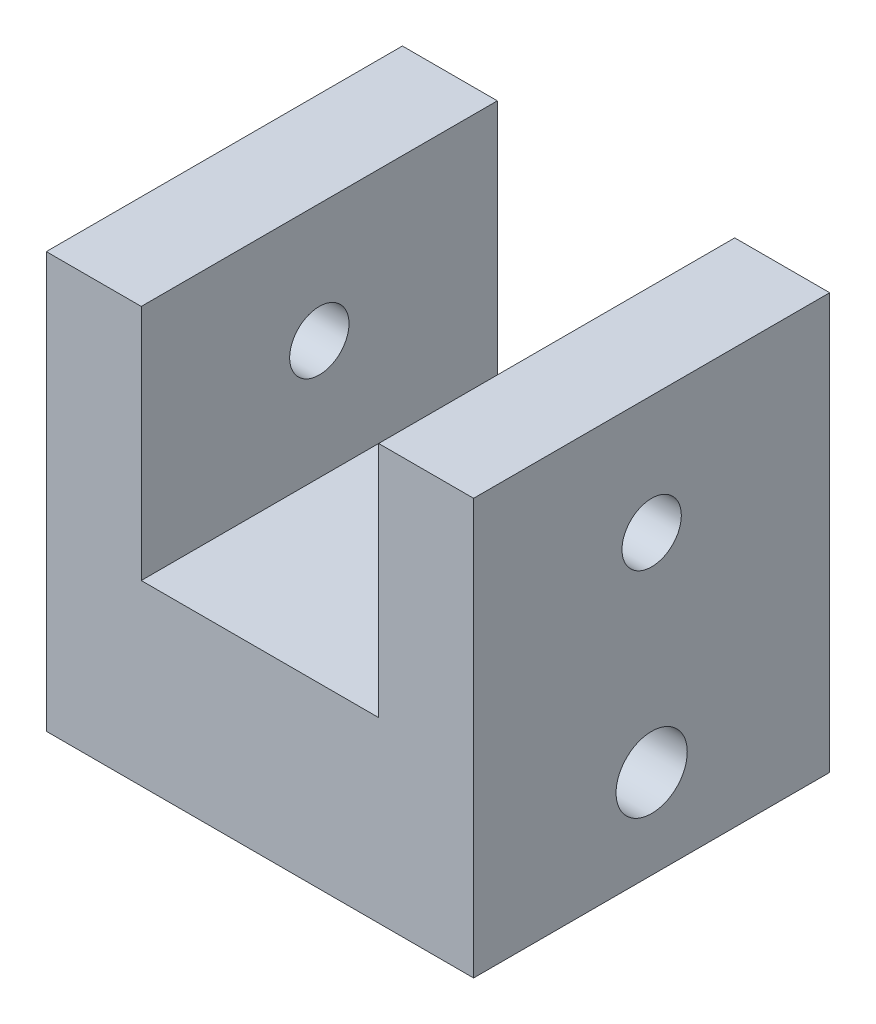
ISO-10303-21;
HEADER;
FILE_DESCRIPTION(('STEP AP214'),'2;1');
FILE_NAME('part.step','',(''),(''),'','','');
FILE_SCHEMA(('AUTOMOTIVE_DESIGN { 1 0 10303 214 1 1 1 1 }'));
ENDSEC;
DATA;
#1=APPLICATION_CONTEXT('core data for automotive mechanical design processes');
#2=APPLICATION_PROTOCOL_DEFINITION('international standard','automotive_design',2000,#1);
#3=PRODUCT_CONTEXT('',#1,'mechanical');
#4=PRODUCT('Part','Part','',(#3));
#5=PRODUCT_RELATED_PRODUCT_CATEGORY('part','',(#4));
#6=PRODUCT_DEFINITION_FORMATION('','',#4);
#7=PRODUCT_DEFINITION_CONTEXT('part definition',#1,'design');
#8=PRODUCT_DEFINITION('design','',#6,#7);
#9=PRODUCT_DEFINITION_SHAPE('','',#8);
#10=(LENGTH_UNIT() NAMED_UNIT(*) SI_UNIT(.MILLI.,.METRE.));
#11=(NAMED_UNIT(*) PLANE_ANGLE_UNIT() SI_UNIT($,.RADIAN.));
#12=(NAMED_UNIT(*) SI_UNIT($,.STERADIAN.) SOLID_ANGLE_UNIT());
#13=UNCERTAINTY_MEASURE_WITH_UNIT(LENGTH_MEASURE(1.E-05),#10,'distance_accuracy_value','');
#14=(GEOMETRIC_REPRESENTATION_CONTEXT(3) GLOBAL_UNCERTAINTY_ASSIGNED_CONTEXT((#13)) GLOBAL_UNIT_ASSIGNED_CONTEXT((#10,
#11,#12)) REPRESENTATION_CONTEXT('',''));
#15=CARTESIAN_POINT('',(0.,0.,0.));
#16=DIRECTION('',(0.,0.,1.));
#17=DIRECTION('',(1.,0.,0.));
#18=AXIS2_PLACEMENT_3D('',#15,#16,#17);
#19=CARTESIAN_POINT('',(0.,0.,30.));
#20=DIRECTION('',(-1.,0.,0.));
#21=DIRECTION('',(0.,0.,1.));
#22=AXIS2_PLACEMENT_3D('',#19,#20,#21);
#23=PLANE('',#22);
#24=CARTESIAN_POINT('',(0.,10.,15.));
#25=DIRECTION('',(-1.,0.,0.));
#26=DIRECTION('',(0.,0.,1.));
#27=AXIS2_PLACEMENT_3D('',#24,#25,#26);
#28=CIRCLE('',#27,2.5);
#29=CARTESIAN_POINT('',(0.,10.,17.5));
#30=VERTEX_POINT('',#29);
#31=EDGE_CURVE('E152',#30,#30,#28,.T.);
#32=ORIENTED_EDGE('',*,*,#31,.T.);
#33=EDGE_LOOP('',(#32));
#34=FACE_BOUND('',#33,.T.);
#35=DIRECTION('',(0.,1.,0.));
#36=VECTOR('',#35,1.);
#37=CARTESIAN_POINT('',(0.,0.,0.));
#38=LINE('',#37,#36);
#39=CARTESIAN_POINT('',(0.,0.,0.));
#40=VERTEX_POINT('',#39);
#41=CARTESIAN_POINT('',(0.,20.,0.));
#42=VERTEX_POINT('',#41);
#43=EDGE_CURVE('E147',#40,#42,#38,.T.);
#44=ORIENTED_EDGE('',*,*,#43,.T.);
#45=DIRECTION('',(0.,0.,-1.));
#46=VECTOR('',#45,1.);
#47=CARTESIAN_POINT('',(0.,20.,30.));
#48=LINE('',#47,#46);
#49=CARTESIAN_POINT('',(0.,20.,30.));
#50=VERTEX_POINT('',#49);
#51=EDGE_CURVE('E11',#50,#42,#48,.T.);
#52=ORIENTED_EDGE('',*,*,#51,.F.);
#53=DIRECTION('',(0.,1.,0.));
#54=VECTOR('',#53,1.);
#55=CARTESIAN_POINT('',(0.,0.,30.));
#56=LINE('',#55,#54);
#57=CARTESIAN_POINT('',(0.,0.,30.));
#58=VERTEX_POINT('',#57);
#59=EDGE_CURVE('E170',#58,#50,#56,.T.);
#60=ORIENTED_EDGE('',*,*,#59,.F.);
#61=DIRECTION('',(0.,0.,-1.));
#62=VECTOR('',#61,1.);
#63=CARTESIAN_POINT('',(0.,0.,30.));
#64=LINE('',#63,#62);
#65=EDGE_CURVE('E143',#58,#40,#64,.T.);
#66=ORIENTED_EDGE('',*,*,#65,.T.);
#67=EDGE_LOOP('',(#44,#52,#60,#66));
#68=FACE_BOUND('',#67,.T.);
#69=ADVANCED_FACE('F45',(#34,#68),#23,.F.);
#70=CARTESIAN_POINT('',(-8.,20.,30.));
#71=DIRECTION('',(0.,-1.,0.));
#72=DIRECTION('',(0.,0.,-1.));
#73=AXIS2_PLACEMENT_3D('',#70,#71,#72);
#74=PLANE('',#73);
#75=DIRECTION('',(-1.,0.,0.));
#76=VECTOR('',#75,1.);
#77=CARTESIAN_POINT('',(-8.,20.,0.));
#78=LINE('',#77,#76);
#79=CARTESIAN_POINT('',(-8.,20.,0.));
#80=VERTEX_POINT('',#79);
#81=EDGE_CURVE('E151',#42,#80,#78,.T.);
#82=ORIENTED_EDGE('',*,*,#81,.T.);
#83=DIRECTION('',(0.,0.,-1.));
#84=VECTOR('',#83,1.);
#85=CARTESIAN_POINT('',(-8.,20.,30.));
#86=LINE('',#85,#84);
#87=CARTESIAN_POINT('',(-8.,20.,30.));
#88=VERTEX_POINT('',#87);
#89=EDGE_CURVE('E55',#88,#80,#86,.T.);
#90=ORIENTED_EDGE('',*,*,#89,.F.);
#91=DIRECTION('',(-1.,0.,0.));
#92=VECTOR('',#91,1.);
#93=CARTESIAN_POINT('',(-8.,20.,30.));
#94=LINE('',#93,#92);
#95=EDGE_CURVE('E106',#50,#88,#94,.T.);
#96=ORIENTED_EDGE('',*,*,#95,.F.);
#97=ORIENTED_EDGE('',*,*,#51,.T.);
#98=EDGE_LOOP('',(#82,#90,#96,#97));
#99=FACE_BOUND('',#98,.T.);
#100=ADVANCED_FACE('F258',(#99),#74,.F.);
#101=CARTESIAN_POINT('',(-8.,20.,30.));
#102=DIRECTION('',(1.,0.,0.));
#103=DIRECTION('',(0.,1.,0.));
#104=AXIS2_PLACEMENT_3D('',#101,#102,#103);
#105=PLANE('',#104);
#106=CARTESIAN_POINT('',(-8.,-7.5,15.));
#107=DIRECTION('',(1.,0.,0.));
#108=DIRECTION('',(0.,0.,-1.));
#109=AXIS2_PLACEMENT_3D('',#106,#107,#108);
#110=CIRCLE('',#109,3.);
#111=CARTESIAN_POINT('',(-8.,-7.5,12.));
#112=VERTEX_POINT('',#111);
#113=EDGE_CURVE('E230',#112,#112,#110,.T.);
#114=ORIENTED_EDGE('',*,*,#113,.T.);
#115=EDGE_LOOP('',(#114));
#116=FACE_BOUND('',#115,.T.);
#117=CARTESIAN_POINT('',(-8.,10.,15.));
#118=DIRECTION('',(1.,0.,0.));
#119=DIRECTION('',(0.,0.,-1.));
#120=AXIS2_PLACEMENT_3D('',#117,#118,#119);
#121=CIRCLE('',#120,2.5);
#122=CARTESIAN_POINT('',(-8.,10.,12.5));
#123=VERTEX_POINT('',#122);
#124=EDGE_CURVE('E218',#123,#123,#121,.T.);
#125=ORIENTED_EDGE('',*,*,#124,.T.);
#126=EDGE_LOOP('',(#125));
#127=FACE_BOUND('',#126,.T.);
#128=DIRECTION('',(0.,-1.,0.));
#129=VECTOR('',#128,1.);
#130=CARTESIAN_POINT('',(-8.,20.,0.));
#131=LINE('',#130,#129);
#132=CARTESIAN_POINT('',(-7.99999999999999,-15.,0.));
#133=VERTEX_POINT('',#132);
#134=EDGE_CURVE('E155',#80,#133,#131,.T.);
#135=ORIENTED_EDGE('',*,*,#134,.T.);
#136=DIRECTION('',(0.,0.,-1.));
#137=VECTOR('',#136,1.);
#138=CARTESIAN_POINT('',(-7.99999999999999,-15.,30.));
#139=LINE('',#138,#137);
#140=CARTESIAN_POINT('',(-7.99999999999999,-15.,30.));
#141=VERTEX_POINT('',#140);
#142=EDGE_CURVE('E181',#141,#133,#139,.T.);
#143=ORIENTED_EDGE('',*,*,#142,.F.);
#144=DIRECTION('',(0.,-1.,0.));
#145=VECTOR('',#144,1.);
#146=CARTESIAN_POINT('',(-8.,20.,30.));
#147=LINE('',#146,#145);
#148=EDGE_CURVE('E192',#88,#141,#147,.T.);
#149=ORIENTED_EDGE('',*,*,#148,.F.);
#150=ORIENTED_EDGE('',*,*,#89,.T.);
#151=EDGE_LOOP('',(#135,#143,#149,#150));
#152=FACE_BOUND('',#151,.T.);
#153=ADVANCED_FACE('F190',(#116,#127,#152),#105,.F.);
#154=CARTESIAN_POINT('',(-7.99999999999999,-15.,30.));
#155=DIRECTION('',(0.,1.,0.));
#156=DIRECTION('',(0.,0.,1.));
#157=AXIS2_PLACEMENT_3D('',#154,#155,#156);
#158=PLANE('',#157);
#159=DIRECTION('',(1.,0.,0.));
#160=VECTOR('',#159,1.);
#161=CARTESIAN_POINT('',(-7.99999999999999,-15.,0.));
#162=LINE('',#161,#160);
#163=CARTESIAN_POINT('',(28.,-15.,0.));
#164=VERTEX_POINT('',#163);
#165=EDGE_CURVE('E158',#133,#164,#162,.T.);
#166=ORIENTED_EDGE('',*,*,#165,.T.);
#167=DIRECTION('',(0.,0.,-1.));
#168=VECTOR('',#167,1.);
#169=CARTESIAN_POINT('',(28.,-15.,30.));
#170=LINE('',#169,#168);
#171=CARTESIAN_POINT('',(28.,-15.,30.));
#172=VERTEX_POINT('',#171);
#173=EDGE_CURVE('E177',#172,#164,#170,.T.);
#174=ORIENTED_EDGE('',*,*,#173,.F.);
#175=DIRECTION('',(1.,0.,0.));
#176=VECTOR('',#175,1.);
#177=CARTESIAN_POINT('',(-7.99999999999999,-15.,30.));
#178=LINE('',#177,#176);
#179=EDGE_CURVE('E205',#141,#172,#178,.T.);
#180=ORIENTED_EDGE('',*,*,#179,.F.);
#181=ORIENTED_EDGE('',*,*,#142,.T.);
#182=EDGE_LOOP('',(#166,#174,#180,#181));
#183=FACE_BOUND('',#182,.T.);
#184=ADVANCED_FACE('F200',(#183),#158,.F.);
#185=CARTESIAN_POINT('',(28.,20.,30.));
#186=DIRECTION('',(-1.,0.,0.));
#187=DIRECTION('',(0.,0.,1.));
#188=AXIS2_PLACEMENT_3D('',#185,#186,#187);
#189=PLANE('',#188);
#190=CARTESIAN_POINT('',(28.,-7.5,15.));
#191=DIRECTION('',(1.,0.,0.));
#192=DIRECTION('',(0.,0.,-1.));
#193=AXIS2_PLACEMENT_3D('',#190,#191,#192);
#194=CIRCLE('',#193,3.);
#195=CARTESIAN_POINT('',(28.,-7.5,12.));
#196=VERTEX_POINT('',#195);
#197=EDGE_CURVE('E226',#196,#196,#194,.T.);
#198=ORIENTED_EDGE('',*,*,#197,.F.);
#199=EDGE_LOOP('',(#198));
#200=FACE_BOUND('',#199,.T.);
#201=CARTESIAN_POINT('',(28.,10.,15.));
#202=DIRECTION('',(1.,0.,0.));
#203=DIRECTION('',(0.,0.,-1.));
#204=AXIS2_PLACEMENT_3D('',#201,#202,#203);
#205=CIRCLE('',#204,2.5);
#206=CARTESIAN_POINT('',(28.,10.,12.5));
#207=VERTEX_POINT('',#206);
#208=EDGE_CURVE('E222',#207,#207,#205,.T.);
#209=ORIENTED_EDGE('',*,*,#208,.F.);
#210=EDGE_LOOP('',(#209));
#211=FACE_BOUND('',#210,.T.);
#212=DIRECTION('',(0.,1.,0.));
#213=VECTOR('',#212,1.);
#214=CARTESIAN_POINT('',(28.,20.,0.));
#215=LINE('',#214,#213);
#216=CARTESIAN_POINT('',(28.,20.,0.));
#217=VERTEX_POINT('',#216);
#218=EDGE_CURVE('E161',#164,#217,#215,.T.);
#219=ORIENTED_EDGE('',*,*,#218,.T.);
#220=DIRECTION('',(0.,0.,-1.));
#221=VECTOR('',#220,1.);
#222=CARTESIAN_POINT('',(28.,20.,30.));
#223=LINE('',#222,#221);
#224=CARTESIAN_POINT('',(28.,20.,30.));
#225=VERTEX_POINT('',#224);
#226=EDGE_CURVE('E136',#225,#217,#223,.T.);
#227=ORIENTED_EDGE('',*,*,#226,.F.);
#228=DIRECTION('',(0.,1.,0.));
#229=VECTOR('',#228,1.);
#230=CARTESIAN_POINT('',(28.,20.,30.));
#231=LINE('',#230,#229);
#232=EDGE_CURVE('E125',#172,#225,#231,.T.);
#233=ORIENTED_EDGE('',*,*,#232,.F.);
#234=ORIENTED_EDGE('',*,*,#173,.T.);
#235=EDGE_LOOP('',(#219,#227,#233,#234));
#236=FACE_BOUND('',#235,.T.);
#237=ADVANCED_FACE('F203',(#200,#211,#236),#189,.F.);
#238=CARTESIAN_POINT('',(20.,20.,30.));
#239=DIRECTION('',(0.,-1.,0.));
#240=DIRECTION('',(0.,0.,-1.));
#241=AXIS2_PLACEMENT_3D('',#238,#239,#240);
#242=PLANE('',#241);
#243=DIRECTION('',(-1.,0.,0.));
#244=VECTOR('',#243,1.);
#245=CARTESIAN_POINT('',(20.,20.,0.));
#246=LINE('',#245,#244);
#247=CARTESIAN_POINT('',(20.,20.,0.));
#248=VERTEX_POINT('',#247);
#249=EDGE_CURVE('E134',#217,#248,#246,.T.);
#250=ORIENTED_EDGE('',*,*,#249,.T.);
#251=DIRECTION('',(0.,0.,-1.));
#252=VECTOR('',#251,1.);
#253=CARTESIAN_POINT('',(20.,20.,30.));
#254=LINE('',#253,#252);
#255=CARTESIAN_POINT('',(20.,20.,30.));
#256=VERTEX_POINT('',#255);
#257=EDGE_CURVE('E131',#256,#248,#254,.T.);
#258=ORIENTED_EDGE('',*,*,#257,.F.);
#259=DIRECTION('',(-1.,0.,0.));
#260=VECTOR('',#259,1.);
#261=CARTESIAN_POINT('',(20.,20.,30.));
#262=LINE('',#261,#260);
#263=EDGE_CURVE('E119',#225,#256,#262,.T.);
#264=ORIENTED_EDGE('',*,*,#263,.F.);
#265=ORIENTED_EDGE('',*,*,#226,.T.);
#266=EDGE_LOOP('',(#250,#258,#264,#265));
#267=FACE_BOUND('',#266,.T.);
#268=ADVANCED_FACE('F132',(#267),#242,.F.);
#269=CARTESIAN_POINT('',(20.,0.,30.));
#270=DIRECTION('',(1.,0.,0.));
#271=DIRECTION('',(0.,0.,-1.));
#272=AXIS2_PLACEMENT_3D('',#269,#270,#271);
#273=PLANE('',#272);
#274=CARTESIAN_POINT('',(20.,10.,15.));
#275=DIRECTION('',(1.,0.,0.));
#276=DIRECTION('',(0.,0.,-1.));
#277=AXIS2_PLACEMENT_3D('',#274,#275,#276);
#278=CIRCLE('',#277,2.5);
#279=CARTESIAN_POINT('',(20.,10.,12.5));
#280=VERTEX_POINT('',#279);
#281=EDGE_CURVE('E48',#280,#280,#278,.T.);
#282=ORIENTED_EDGE('',*,*,#281,.T.);
#283=EDGE_LOOP('',(#282));
#284=FACE_BOUND('',#283,.T.);
#285=DIRECTION('',(0.,-1.,0.));
#286=VECTOR('',#285,1.);
#287=CARTESIAN_POINT('',(20.,0.,0.));
#288=LINE('',#287,#286);
#289=CARTESIAN_POINT('',(20.,0.,0.));
#290=VERTEX_POINT('',#289);
#291=EDGE_CURVE('E92',#248,#290,#288,.T.);
#292=ORIENTED_EDGE('',*,*,#291,.T.);
#293=DIRECTION('',(0.,0.,-1.));
#294=VECTOR('',#293,1.);
#295=CARTESIAN_POINT('',(20.,0.,30.));
#296=LINE('',#295,#294);
#297=CARTESIAN_POINT('',(20.,0.,30.));
#298=VERTEX_POINT('',#297);
#299=EDGE_CURVE('E137',#298,#290,#296,.T.);
#300=ORIENTED_EDGE('',*,*,#299,.F.);
#301=DIRECTION('',(0.,-1.,0.));
#302=VECTOR('',#301,1.);
#303=CARTESIAN_POINT('',(20.,0.,30.));
#304=LINE('',#303,#302);
#305=EDGE_CURVE('E123',#256,#298,#304,.T.);
#306=ORIENTED_EDGE('',*,*,#305,.F.);
#307=ORIENTED_EDGE('',*,*,#257,.T.);
#308=EDGE_LOOP('',(#292,#300,#306,#307));
#309=FACE_BOUND('',#308,.T.);
#310=ADVANCED_FACE('F139',(#284,#309),#273,.F.);
#311=CARTESIAN_POINT('',(0.,0.,30.));
#312=DIRECTION('',(0.,-1.,0.));
#313=DIRECTION('',(0.,0.,-1.));
#314=AXIS2_PLACEMENT_3D('',#311,#312,#313);
#315=PLANE('',#314);
#316=DIRECTION('',(-1.,0.,0.));
#317=VECTOR('',#316,1.);
#318=CARTESIAN_POINT('',(0.,0.,0.));
#319=LINE('',#318,#317);
#320=EDGE_CURVE('E98',#290,#40,#319,.T.);
#321=ORIENTED_EDGE('',*,*,#320,.T.);
#322=ORIENTED_EDGE('',*,*,#65,.F.);
#323=DIRECTION('',(-1.,0.,0.));
#324=VECTOR('',#323,1.);
#325=CARTESIAN_POINT('',(0.,0.,30.));
#326=LINE('',#325,#324);
#327=EDGE_CURVE('E63',#298,#58,#326,.T.);
#328=ORIENTED_EDGE('',*,*,#327,.F.);
#329=ORIENTED_EDGE('',*,*,#299,.T.);
#330=EDGE_LOOP('',(#321,#322,#328,#329));
#331=FACE_BOUND('',#330,.T.);
#332=ADVANCED_FACE('F268',(#331),#315,.F.);
#333=CARTESIAN_POINT('',(0.,0.,30.));
#334=DIRECTION('',(0.,0.,-1.));
#335=DIRECTION('',(-1.,0.,0.));
#336=AXIS2_PLACEMENT_3D('',#333,#334,#335);
#337=PLANE('',#336);
#338=ORIENTED_EDGE('',*,*,#59,.T.);
#339=ORIENTED_EDGE('',*,*,#95,.T.);
#340=ORIENTED_EDGE('',*,*,#148,.T.);
#341=ORIENTED_EDGE('',*,*,#179,.T.);
#342=ORIENTED_EDGE('',*,*,#232,.T.);
#343=ORIENTED_EDGE('',*,*,#263,.T.);
#344=ORIENTED_EDGE('',*,*,#305,.T.);
#345=ORIENTED_EDGE('',*,*,#327,.T.);
#346=EDGE_LOOP('',(#338,#339,#340,#341,#342,#343,#344,#345));
#347=FACE_BOUND('',#346,.T.);
#348=ADVANCED_FACE('F121',(#347),#337,.F.);
#349=CARTESIAN_POINT('',(0.,0.,0.));
#350=DIRECTION('',(0.,0.,-1.));
#351=DIRECTION('',(-1.,0.,0.));
#352=AXIS2_PLACEMENT_3D('',#349,#350,#351);
#353=PLANE('',#352);
#354=ORIENTED_EDGE('',*,*,#43,.F.);
#355=ORIENTED_EDGE('',*,*,#320,.F.);
#356=ORIENTED_EDGE('',*,*,#291,.F.);
#357=ORIENTED_EDGE('',*,*,#249,.F.);
#358=ORIENTED_EDGE('',*,*,#218,.F.);
#359=ORIENTED_EDGE('',*,*,#165,.F.);
#360=ORIENTED_EDGE('',*,*,#134,.F.);
#361=ORIENTED_EDGE('',*,*,#81,.F.);
#362=EDGE_LOOP('',(#354,#355,#356,#357,#358,#359,#360,#361));
#363=FACE_BOUND('',#362,.T.);
#364=ADVANCED_FACE('F196',(#363),#353,.T.);
#365=CARTESIAN_POINT('',(-8.,10.,15.));
#366=DIRECTION('',(1.,0.,0.));
#367=DIRECTION('',(0.,0.,-1.));
#368=AXIS2_PLACEMENT_3D('',#365,#366,#367);
#369=CYLINDRICAL_SURFACE('',#368,2.5);
#370=ORIENTED_EDGE('',*,*,#208,.T.);
#371=EDGE_LOOP('',(#370));
#372=FACE_BOUND('',#371,.T.);
#373=ORIENTED_EDGE('',*,*,#281,.F.);
#374=EDGE_LOOP('',(#373));
#375=FACE_BOUND('',#374,.T.);
#376=ADVANCED_FACE('F240',(#372,#375),#369,.F.);
#377=CARTESIAN_POINT('',(-8.,-7.5,15.));
#378=DIRECTION('',(1.,0.,0.));
#379=DIRECTION('',(0.,0.,-1.));
#380=AXIS2_PLACEMENT_3D('',#377,#378,#379);
#381=CYLINDRICAL_SURFACE('',#380,3.);
#382=ORIENTED_EDGE('',*,*,#113,.F.);
#383=EDGE_LOOP('',(#382));
#384=FACE_BOUND('',#383,.T.);
#385=ORIENTED_EDGE('',*,*,#197,.T.);
#386=EDGE_LOOP('',(#385));
#387=FACE_BOUND('',#386,.T.);
#388=ADVANCED_FACE('F242',(#384,#387),#381,.F.);
#389=ORIENTED_EDGE('',*,*,#124,.F.);
#390=EDGE_LOOP('',(#389));
#391=FACE_BOUND('',#390,.T.);
#392=ORIENTED_EDGE('',*,*,#31,.F.);
#393=EDGE_LOOP('',(#392));
#394=FACE_BOUND('',#393,.T.);
#395=ADVANCED_FACE('F245',(#391,#394),#369,.F.);
#396=CLOSED_SHELL('',(#69,#100,#153,#184,#237,#268,#310,#332,#348,#364,#376,#388,#395));
#397=MANIFOLD_SOLID_BREP('B2',#396);
#398=ADVANCED_BREP_SHAPE_REPRESENTATION('',(#18,#397),#14);
#399=SHAPE_DEFINITION_REPRESENTATION(#9,#398);
ENDSEC;
END-ISO-10303-21;
